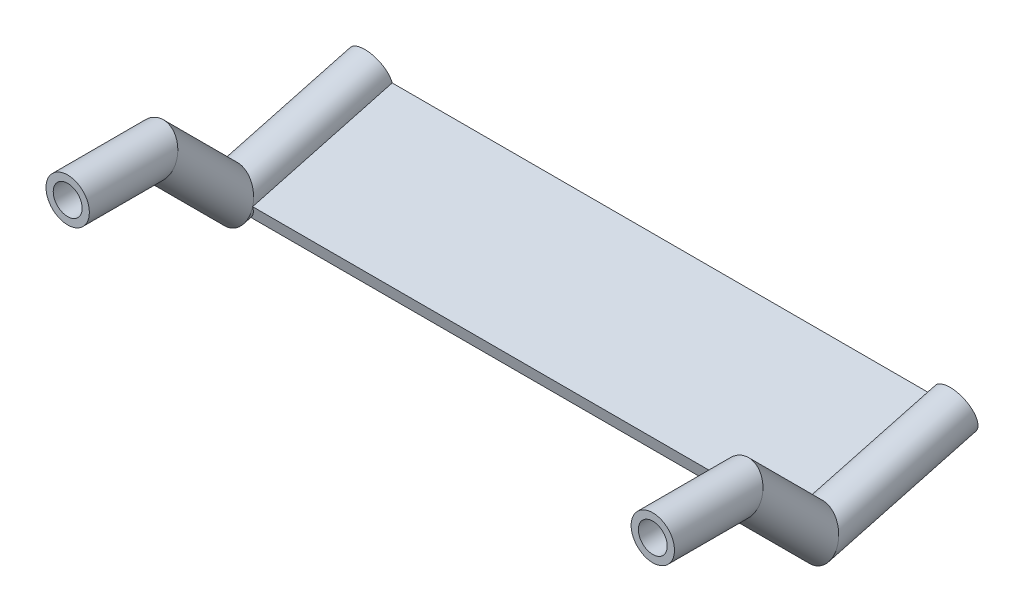
ISO-10303-21;
HEADER;
FILE_DESCRIPTION(('STEP AP214'),'2;1');
FILE_NAME('part.step','',(''),(''),'','','');
FILE_SCHEMA(('AUTOMOTIVE_DESIGN { 1 0 10303 214 1 1 1 1 }'));
ENDSEC;
DATA;
#1=APPLICATION_CONTEXT('core data for automotive mechanical design processes');
#2=APPLICATION_PROTOCOL_DEFINITION('international standard','automotive_design',2000,#1);
#3=PRODUCT_CONTEXT('',#1,'mechanical');
#4=PRODUCT('Part','Part','',(#3));
#5=PRODUCT_RELATED_PRODUCT_CATEGORY('part','',(#4));
#6=PRODUCT_DEFINITION_FORMATION('','',#4);
#7=PRODUCT_DEFINITION_CONTEXT('part definition',#1,'design');
#8=PRODUCT_DEFINITION('design','',#6,#7);
#9=PRODUCT_DEFINITION_SHAPE('','',#8);
#10=(LENGTH_UNIT() NAMED_UNIT(*) SI_UNIT(.MILLI.,.METRE.));
#11=(NAMED_UNIT(*) PLANE_ANGLE_UNIT() SI_UNIT($,.RADIAN.));
#12=(NAMED_UNIT(*) SI_UNIT($,.STERADIAN.) SOLID_ANGLE_UNIT());
#13=UNCERTAINTY_MEASURE_WITH_UNIT(LENGTH_MEASURE(1.E-05),#10,'distance_accuracy_value','');
#14=(GEOMETRIC_REPRESENTATION_CONTEXT(3) GLOBAL_UNCERTAINTY_ASSIGNED_CONTEXT((#13)) GLOBAL_UNIT_ASSIGNED_CONTEXT((#10,
#11,#12)) REPRESENTATION_CONTEXT('',''));
#15=CARTESIAN_POINT('',(0.,0.,0.));
#16=DIRECTION('',(0.,0.,1.));
#17=DIRECTION('',(1.,0.,0.));
#18=AXIS2_PLACEMENT_3D('',#15,#16,#17);
#19=CARTESIAN_POINT('',(0.,-111.023064179417,-207.566065913121));
#20=DIRECTION('',(0.,0.258819045102522,-0.965925826289068));
#21=DIRECTION('',(0.,0.965925826289068,0.258819045102522));
#22=AXIS2_PLACEMENT_3D('',#19,#20,#21);
#23=CYLINDRICAL_SURFACE('',#22,30.);
#24=DIRECTION('',(0.,0.258819045102522,-0.965925826289068));
#25=VECTOR('',#24,1.);
#26=CARTESIAN_POINT('',(22.3606797749979,-130.341580705198,-212.742446815172));
#27=LINE('',#26,#25);
#28=CARTESIAN_POINT('',(22.3606797749979,-125.384533703764,-231.242398080032));
#29=VERTEX_POINT('',#28);
#30=CARTESIAN_POINT('',(22.3606797749979,-73.6207246832593,-424.427563337846));
#31=VERTEX_POINT('',#30);
#32=EDGE_CURVE('E12',#29,#31,#27,.T.);
#33=ORIENTED_EDGE('',*,*,#32,.F.);
#34=CARTESIAN_POINT('',(0.,-106.066017177982,-226.066017177982));
#35=DIRECTION('',(0.,-0.258819045102522,0.965925826289068));
#36=DIRECTION('',(0.,-0.965925826289068,-0.258819045102522));
#37=AXIS2_PLACEMENT_3D('',#34,#35,#36);
#38=CIRCLE('',#37,30.);
#39=CARTESIAN_POINT('',(30.,-106.066017177982,-226.066017177982));
#40=VERTEX_POINT('',#39);
#41=EDGE_CURVE('E84',#29,#40,#38,.T.);
#42=ORIENTED_EDGE('',*,*,#41,.T.);
#43=CARTESIAN_POINT('',(0.,-106.066017177982,-226.066017177982));
#44=DIRECTION('',(0.,-0.258819045102521,-0.965925826289068));
#45=DIRECTION('',(0.,-0.965925826289068,0.258819045102521));
#46=AXIS2_PLACEMENT_3D('',#43,#44,#45);
#47=ELLIPSE('',#46,34.6410161513776,30.);
#48=EDGE_CURVE('E132',#40,#40,#47,.T.);
#49=ORIENTED_EDGE('',*,*,#48,.T.);
#50=DIRECTION('',(0.,0.258819045102522,-0.965925826289068));
#51=VECTOR('',#50,1.);
#52=CARTESIAN_POINT('',(30.,-111.023064179417,-207.566065913121));
#53=LINE('',#52,#51);
#54=CARTESIAN_POINT('',(30.,-54.3022081574779,-419.251182435796));
#55=VERTEX_POINT('',#54);
#56=EDGE_CURVE('E113',#40,#55,#53,.T.);
#57=ORIENTED_EDGE('',*,*,#56,.T.);
#58=CARTESIAN_POINT('',(0.,-54.3022081574779,-419.251182435796));
#59=DIRECTION('',(0.,-0.258819045102521,0.965925826289068));
#60=DIRECTION('',(0.,-0.965925826289068,-0.258819045102521));
#61=AXIS2_PLACEMENT_3D('',#58,#59,#60);
#62=CIRCLE('',#61,30.);
#63=EDGE_CURVE('E124',#55,#31,#62,.T.);
#64=ORIENTED_EDGE('',*,*,#63,.T.);
#65=EDGE_LOOP('',(#33,#42,#49,#57,#64));
#66=FACE_BOUND('',#65,.T.);
#67=ADVANCED_FACE('F39',(#66),#23,.T.);
#68=CARTESIAN_POINT('',(0.,-54.3022081574779,-419.251182435796));
#69=DIRECTION('',(0.,-0.258819045102521,0.965925826289068));
#70=DIRECTION('',(0.,-0.965925826289068,-0.258819045102521));
#71=AXIS2_PLACEMENT_3D('',#68,#69,#70);
#72=PLANE('',#71);
#73=DIRECTION('',(-1.,0.,0.));
#74=VECTOR('',#73,1.);
#75=CARTESIAN_POINT('',(780.,-73.6207246832593,-424.427563337846));
#76=LINE('',#75,#74);
#77=CARTESIAN_POINT('',(787.639320225002,-73.6207246832593,-424.427563337846));
#78=VERTEX_POINT('',#77);
#79=EDGE_CURVE('E62',#78,#31,#76,.T.);
#80=ORIENTED_EDGE('',*,*,#79,.T.);
#81=ORIENTED_EDGE('',*,*,#63,.F.);
#82=DIRECTION('',(-1.,0.,0.));
#83=VECTOR('',#82,1.);
#84=CARTESIAN_POINT('',(780.,-54.3022081574779,-419.251182435796));
#85=LINE('',#84,#83);
#86=CARTESIAN_POINT('',(780.,-54.3022081574779,-419.251182435796));
#87=VERTEX_POINT('',#86);
#88=EDGE_CURVE('E109',#87,#55,#85,.T.);
#89=ORIENTED_EDGE('',*,*,#88,.F.);
#90=CARTESIAN_POINT('',(810.,-54.3022081574779,-419.251182435796));
#91=DIRECTION('',(0.,0.258819045102521,-0.965925826289068));
#92=DIRECTION('',(0.,-0.965925826289068,-0.258819045102521));
#93=AXIS2_PLACEMENT_3D('',#90,#91,#92);
#94=CIRCLE('',#93,30.);
#95=EDGE_CURVE('E105',#87,#78,#94,.T.);
#96=ORIENTED_EDGE('',*,*,#95,.T.);
#97=EDGE_LOOP('',(#80,#81,#89,#96));
#98=FACE_BOUND('',#97,.T.);
#99=CARTESIAN_POINT('',(810.,-54.3022081574779,-419.251182435796));
#100=DIRECTION('',(0.,0.258819045102521,-0.965925826289068));
#101=DIRECTION('',(0.,-0.965925826289068,-0.258819045102521));
#102=AXIS2_PLACEMENT_3D('',#99,#100,#101);
#103=CIRCLE('',#102,20.);
#104=CARTESIAN_POINT('',(810.,-73.6207246832593,-424.427563337846));
#105=VERTEX_POINT('',#104);
#106=EDGE_CURVE('E143',#105,#105,#103,.T.);
#107=ORIENTED_EDGE('',*,*,#106,.F.);
#108=EDGE_LOOP('',(#107));
#109=FACE_BOUND('',#108,.T.);
#110=CARTESIAN_POINT('',(0.,-54.3022081574779,-419.251182435796));
#111=DIRECTION('',(0.,-0.258819045102521,0.965925826289068));
#112=DIRECTION('',(0.,-0.965925826289068,-0.258819045102521));
#113=AXIS2_PLACEMENT_3D('',#110,#111,#112);
#114=CIRCLE('',#113,20.);
#115=CARTESIAN_POINT('',(0.,-73.6207246832593,-424.427563337846));
#116=VERTEX_POINT('',#115);
#117=EDGE_CURVE('E116',#116,#116,#114,.T.);
#118=ORIENTED_EDGE('',*,*,#117,.T.);
#119=EDGE_LOOP('',(#118));
#120=FACE_BOUND('',#119,.T.);
#121=ADVANCED_FACE('F41',(#98,#109,#120),#72,.F.);
#122=CARTESIAN_POINT('',(0.,0.,0.));
#123=DIRECTION('',(0.,0.,1.));
#124=DIRECTION('',(0.,-1.,0.));
#125=AXIS2_PLACEMENT_3D('',#122,#123,#124);
#126=PLANE('',#125);
#127=CARTESIAN_POINT('',(0.,0.,0.));
#128=DIRECTION('',(0.,0.,1.));
#129=DIRECTION('',(0.,-1.,0.));
#130=AXIS2_PLACEMENT_3D('',#127,#128,#129);
#131=CIRCLE('',#130,20.);
#132=CARTESIAN_POINT('',(0.,-20.,0.));
#133=VERTEX_POINT('',#132);
#134=EDGE_CURVE('E120',#133,#133,#131,.T.);
#135=ORIENTED_EDGE('',*,*,#134,.F.);
#136=EDGE_LOOP('',(#135));
#137=FACE_BOUND('',#136,.T.);
#138=CARTESIAN_POINT('',(0.,0.,0.));
#139=DIRECTION('',(0.,0.,1.));
#140=DIRECTION('',(0.,-1.,0.));
#141=AXIS2_PLACEMENT_3D('',#138,#139,#140);
#142=CIRCLE('',#141,30.);
#143=CARTESIAN_POINT('',(0.,-30.,0.));
#144=VERTEX_POINT('',#143);
#145=EDGE_CURVE('E129',#144,#144,#142,.T.);
#146=ORIENTED_EDGE('',*,*,#145,.T.);
#147=EDGE_LOOP('',(#146));
#148=FACE_BOUND('',#147,.T.);
#149=ADVANCED_FACE('F182',(#137,#148),#126,.T.);
#150=CARTESIAN_POINT('',(0.,9.73618689896272,-110.263813101037));
#151=DIRECTION('',(0.,-0.707106781186548,-0.707106781186546));
#152=DIRECTION('',(0.,0.707106781186546,-0.707106781186549));
#153=AXIS2_PLACEMENT_3D('',#150,#151,#152);
#154=CYLINDRICAL_SURFACE('',#153,30.);
#155=CARTESIAN_POINT('',(0.,0.,-120.));
#156=DIRECTION('',(0.,-0.382683432365091,-0.923879532511287));
#157=DIRECTION('',(0.,0.923879532511287,-0.382683432365091));
#158=AXIS2_PLACEMENT_3D('',#155,#156,#157);
#159=ELLIPSE('',#158,32.4717660087718,30.);
#160=CARTESIAN_POINT('',(0.,30.,-132.426406871193));
#161=VERTEX_POINT('',#160);
#162=EDGE_CURVE('E47',#161,#161,#159,.T.);
#163=ORIENTED_EDGE('',*,*,#162,.T.);
#164=EDGE_LOOP('',(#163));
#165=FACE_BOUND('',#164,.T.);
#166=ORIENTED_EDGE('',*,*,#48,.F.);
#167=EDGE_LOOP('',(#166));
#168=FACE_BOUND('',#167,.T.);
#169=ADVANCED_FACE('F187',(#165,#168),#154,.T.);
#170=CARTESIAN_POINT('',(0.,0.,0.));
#171=DIRECTION('',(0.,0.,-1.));
#172=DIRECTION('',(-1.,0.,0.));
#173=AXIS2_PLACEMENT_3D('',#170,#171,#172);
#174=CYLINDRICAL_SURFACE('',#173,30.);
#175=ORIENTED_EDGE('',*,*,#145,.F.);
#176=EDGE_LOOP('',(#175));
#177=FACE_BOUND('',#176,.T.);
#178=ORIENTED_EDGE('',*,*,#162,.F.);
#179=EDGE_LOOP('',(#178));
#180=FACE_BOUND('',#179,.T.);
#181=ADVANCED_FACE('F178',(#177,#180),#174,.T.);
#182=CARTESIAN_POINT('',(0.,-111.023064179417,-207.566065913121));
#183=DIRECTION('',(0.,0.258819045102522,-0.965925826289068));
#184=DIRECTION('',(0.,0.965925826289068,0.258819045102522));
#185=AXIS2_PLACEMENT_3D('',#182,#183,#184);
#186=CYLINDRICAL_SURFACE('',#185,20.);
#187=ORIENTED_EDGE('',*,*,#117,.F.);
#188=EDGE_LOOP('',(#187));
#189=FACE_BOUND('',#188,.T.);
#190=CARTESIAN_POINT('',(0.,-106.066017177982,-226.066017177982));
#191=DIRECTION('',(0.,-0.258819045102521,-0.965925826289068));
#192=DIRECTION('',(0.,0.965925826289068,-0.258819045102521));
#193=AXIS2_PLACEMENT_3D('',#190,#191,#192);
#194=ELLIPSE('',#193,23.094010767585,20.);
#195=CARTESIAN_POINT('',(0.,-83.758915744974,-232.043186992436));
#196=VERTEX_POINT('',#195);
#197=EDGE_CURVE('E117',#196,#196,#194,.T.);
#198=ORIENTED_EDGE('',*,*,#197,.F.);
#199=EDGE_LOOP('',(#198));
#200=FACE_BOUND('',#199,.T.);
#201=ADVANCED_FACE('F186',(#189,#200),#186,.F.);
#202=CARTESIAN_POINT('',(0.,9.73618689896272,-110.263813101037));
#203=DIRECTION('',(0.,-0.707106781186548,-0.707106781186546));
#204=DIRECTION('',(0.,0.707106781186546,-0.707106781186549));
#205=AXIS2_PLACEMENT_3D('',#202,#203,#204);
#206=CYLINDRICAL_SURFACE('',#205,20.);
#207=CARTESIAN_POINT('',(0.,0.,-120.));
#208=DIRECTION('',(0.,-0.38268343236509,-0.923879532511287));
#209=DIRECTION('',(0.,-0.923879532511286,0.382683432365091));
#210=AXIS2_PLACEMENT_3D('',#207,#208,#209);
#211=ELLIPSE('',#210,21.6478440058479,20.);
#212=CARTESIAN_POINT('',(0.,-20.,-111.715728752538));
#213=VERTEX_POINT('',#212);
#214=EDGE_CURVE('E121',#213,#213,#211,.T.);
#215=ORIENTED_EDGE('',*,*,#214,.F.);
#216=EDGE_LOOP('',(#215));
#217=FACE_BOUND('',#216,.T.);
#218=ORIENTED_EDGE('',*,*,#197,.T.);
#219=EDGE_LOOP('',(#218));
#220=FACE_BOUND('',#219,.T.);
#221=ADVANCED_FACE('F194',(#217,#220),#206,.F.);
#222=CARTESIAN_POINT('',(0.,0.,0.));
#223=DIRECTION('',(0.,0.,-1.));
#224=DIRECTION('',(-1.,0.,0.));
#225=AXIS2_PLACEMENT_3D('',#222,#223,#224);
#226=CYLINDRICAL_SURFACE('',#225,20.);
#227=ORIENTED_EDGE('',*,*,#134,.T.);
#228=EDGE_LOOP('',(#227));
#229=FACE_BOUND('',#228,.T.);
#230=ORIENTED_EDGE('',*,*,#214,.T.);
#231=EDGE_LOOP('',(#230));
#232=FACE_BOUND('',#231,.T.);
#233=ADVANCED_FACE('F183',(#229,#232),#226,.F.);
#234=CARTESIAN_POINT('',(780.,-125.384533703764,-231.242398080032));
#235=DIRECTION('',(0.,0.965925826289068,0.258819045102522));
#236=DIRECTION('',(0.,-0.258819045102522,0.965925826289068));
#237=AXIS2_PLACEMENT_3D('',#234,#235,#236);
#238=PLANE('',#237);
#239=DIRECTION('',(-1.,0.,0.));
#240=VECTOR('',#239,1.);
#241=CARTESIAN_POINT('',(780.,-125.384533703764,-231.242398080032));
#242=LINE('',#241,#240);
#243=CARTESIAN_POINT('',(787.639320225002,-125.384533703764,-231.242398080032));
#244=VERTEX_POINT('',#243);
#245=EDGE_CURVE('E79',#244,#29,#242,.T.);
#246=ORIENTED_EDGE('',*,*,#245,.T.);
#247=ORIENTED_EDGE('',*,*,#32,.T.);
#248=ORIENTED_EDGE('',*,*,#79,.F.);
#249=DIRECTION('',(0.,0.258819045102522,-0.965925826289068));
#250=VECTOR('',#249,1.);
#251=CARTESIAN_POINT('',(787.639320225002,-130.341580705198,-212.742446815172));
#252=LINE('',#251,#250);
#253=EDGE_CURVE('E88',#244,#78,#252,.T.);
#254=ORIENTED_EDGE('',*,*,#253,.F.);
#255=EDGE_LOOP('',(#246,#247,#248,#254));
#256=FACE_BOUND('',#255,.T.);
#257=ADVANCED_FACE('F98',(#256),#238,.F.);
#258=CARTESIAN_POINT('',(780.,-106.066017177982,-226.066017177982));
#259=DIRECTION('',(0.,0.965925826289068,0.258819045102522));
#260=DIRECTION('',(0.,-0.258819045102522,0.965925826289068));
#261=AXIS2_PLACEMENT_3D('',#258,#259,#260);
#262=PLANE('',#261);
#263=ORIENTED_EDGE('',*,*,#56,.F.);
#264=DIRECTION('',(-1.,0.,0.));
#265=VECTOR('',#264,1.);
#266=CARTESIAN_POINT('',(780.,-106.066017177982,-226.066017177982));
#267=LINE('',#266,#265);
#268=CARTESIAN_POINT('',(780.,-106.066017177982,-226.066017177982));
#269=VERTEX_POINT('',#268);
#270=EDGE_CURVE('E54',#269,#40,#267,.T.);
#271=ORIENTED_EDGE('',*,*,#270,.F.);
#272=DIRECTION('',(0.,0.258819045102522,-0.965925826289068));
#273=VECTOR('',#272,1.);
#274=CARTESIAN_POINT('',(780.,-111.023064179417,-207.566065913121));
#275=LINE('',#274,#273);
#276=EDGE_CURVE('E96',#269,#87,#275,.T.);
#277=ORIENTED_EDGE('',*,*,#276,.T.);
#278=ORIENTED_EDGE('',*,*,#88,.T.);
#279=EDGE_LOOP('',(#263,#271,#277,#278));
#280=FACE_BOUND('',#279,.T.);
#281=ADVANCED_FACE('F142',(#280),#262,.T.);
#282=CARTESIAN_POINT('',(780.,-125.384533703764,-231.242398080032));
#283=DIRECTION('',(0.,-0.258819045102522,0.965925826289068));
#284=DIRECTION('',(0.,-0.965925826289068,-0.258819045102522));
#285=AXIS2_PLACEMENT_3D('',#282,#283,#284);
#286=PLANE('',#285);
#287=ORIENTED_EDGE('',*,*,#270,.T.);
#288=ORIENTED_EDGE('',*,*,#41,.F.);
#289=ORIENTED_EDGE('',*,*,#245,.F.);
#290=CARTESIAN_POINT('',(810.,-106.066017177982,-226.066017177982));
#291=DIRECTION('',(0.,0.258819045102522,-0.965925826289068));
#292=DIRECTION('',(0.,-0.965925826289068,-0.258819045102522));
#293=AXIS2_PLACEMENT_3D('',#290,#291,#292);
#294=CIRCLE('',#293,30.);
#295=EDGE_CURVE('E82',#244,#269,#294,.T.);
#296=ORIENTED_EDGE('',*,*,#295,.T.);
#297=EDGE_LOOP('',(#287,#288,#289,#296));
#298=FACE_BOUND('',#297,.T.);
#299=ADVANCED_FACE('F81',(#298),#286,.T.);
#300=CARTESIAN_POINT('',(810.,-111.023064179417,-207.566065913121));
#301=DIRECTION('',(0.,0.258819045102522,-0.965925826289068));
#302=DIRECTION('',(0.,0.965925826289068,0.258819045102522));
#303=AXIS2_PLACEMENT_3D('',#300,#301,#302);
#304=CYLINDRICAL_SURFACE('',#303,30.);
#305=ORIENTED_EDGE('',*,*,#253,.T.);
#306=ORIENTED_EDGE('',*,*,#95,.F.);
#307=ORIENTED_EDGE('',*,*,#276,.F.);
#308=CARTESIAN_POINT('',(810.,-106.066017177982,-226.066017177982));
#309=DIRECTION('',(0.,0.258819045102521,0.965925826289068));
#310=DIRECTION('',(0.,-0.965925826289068,0.258819045102521));
#311=AXIS2_PLACEMENT_3D('',#308,#309,#310);
#312=ELLIPSE('',#311,34.6410161513776,30.);
#313=EDGE_CURVE('E95',#269,#269,#312,.T.);
#314=ORIENTED_EDGE('',*,*,#313,.F.);
#315=ORIENTED_EDGE('',*,*,#295,.F.);
#316=EDGE_LOOP('',(#305,#306,#307,#314,#315));
#317=FACE_BOUND('',#316,.T.);
#318=ADVANCED_FACE('F93',(#317),#304,.T.);
#319=CARTESIAN_POINT('',(810.,0.,0.));
#320=DIRECTION('',(0.,0.,1.));
#321=DIRECTION('',(0.,-1.,0.));
#322=AXIS2_PLACEMENT_3D('',#319,#320,#321);
#323=PLANE('',#322);
#324=CARTESIAN_POINT('',(810.,0.,0.));
#325=DIRECTION('',(0.,0.,-1.));
#326=DIRECTION('',(0.,-1.,0.));
#327=AXIS2_PLACEMENT_3D('',#324,#325,#326);
#328=CIRCLE('',#327,20.);
#329=CARTESIAN_POINT('',(810.,-20.,0.));
#330=VERTEX_POINT('',#329);
#331=EDGE_CURVE('E151',#330,#330,#328,.T.);
#332=ORIENTED_EDGE('',*,*,#331,.T.);
#333=EDGE_LOOP('',(#332));
#334=FACE_BOUND('',#333,.T.);
#335=CARTESIAN_POINT('',(810.,0.,0.));
#336=DIRECTION('',(0.,0.,-1.));
#337=DIRECTION('',(0.,-1.,0.));
#338=AXIS2_PLACEMENT_3D('',#335,#336,#337);
#339=CIRCLE('',#338,30.);
#340=CARTESIAN_POINT('',(810.,-30.,0.));
#341=VERTEX_POINT('',#340);
#342=EDGE_CURVE('E102',#341,#341,#339,.T.);
#343=ORIENTED_EDGE('',*,*,#342,.F.);
#344=EDGE_LOOP('',(#343));
#345=FACE_BOUND('',#344,.T.);
#346=ADVANCED_FACE('F162',(#334,#345),#323,.T.);
#347=CARTESIAN_POINT('',(810.,9.73618689896272,-110.263813101037));
#348=DIRECTION('',(0.,-0.707106781186548,-0.707106781186546));
#349=DIRECTION('',(0.,0.707106781186546,-0.707106781186549));
#350=AXIS2_PLACEMENT_3D('',#347,#348,#349);
#351=CYLINDRICAL_SURFACE('',#350,30.);
#352=CARTESIAN_POINT('',(810.,0.,-120.));
#353=DIRECTION('',(0.,0.382683432365091,0.923879532511287));
#354=DIRECTION('',(0.,0.923879532511287,-0.382683432365091));
#355=AXIS2_PLACEMENT_3D('',#352,#353,#354);
#356=ELLIPSE('',#355,32.4717660087718,30.);
#357=CARTESIAN_POINT('',(810.,30.,-132.426406871193));
#358=VERTEX_POINT('',#357);
#359=EDGE_CURVE('E99',#358,#358,#356,.T.);
#360=ORIENTED_EDGE('',*,*,#359,.F.);
#361=EDGE_LOOP('',(#360));
#362=FACE_BOUND('',#361,.T.);
#363=ORIENTED_EDGE('',*,*,#313,.T.);
#364=EDGE_LOOP('',(#363));
#365=FACE_BOUND('',#364,.T.);
#366=ADVANCED_FACE('F159',(#362,#365),#351,.T.);
#367=CARTESIAN_POINT('',(810.,0.,0.));
#368=DIRECTION('',(0.,0.,-1.));
#369=DIRECTION('',(1.,0.,0.));
#370=AXIS2_PLACEMENT_3D('',#367,#368,#369);
#371=CYLINDRICAL_SURFACE('',#370,30.);
#372=ORIENTED_EDGE('',*,*,#342,.T.);
#373=EDGE_LOOP('',(#372));
#374=FACE_BOUND('',#373,.T.);
#375=ORIENTED_EDGE('',*,*,#359,.T.);
#376=EDGE_LOOP('',(#375));
#377=FACE_BOUND('',#376,.T.);
#378=ADVANCED_FACE('F161',(#374,#377),#371,.T.);
#379=CARTESIAN_POINT('',(810.,-111.023064179417,-207.566065913121));
#380=DIRECTION('',(0.,0.258819045102522,-0.965925826289068));
#381=DIRECTION('',(0.,0.965925826289068,0.258819045102522));
#382=AXIS2_PLACEMENT_3D('',#379,#380,#381);
#383=CYLINDRICAL_SURFACE('',#382,20.);
#384=ORIENTED_EDGE('',*,*,#106,.T.);
#385=EDGE_LOOP('',(#384));
#386=FACE_BOUND('',#385,.T.);
#387=CARTESIAN_POINT('',(810.,-106.066017177982,-226.066017177982));
#388=DIRECTION('',(0.,0.258819045102521,0.965925826289068));
#389=DIRECTION('',(0.,0.965925826289068,-0.258819045102521));
#390=AXIS2_PLACEMENT_3D('',#387,#388,#389);
#391=ELLIPSE('',#390,23.094010767585,20.);
#392=CARTESIAN_POINT('',(810.,-83.758915744974,-232.043186992436));
#393=VERTEX_POINT('',#392);
#394=EDGE_CURVE('E146',#393,#393,#391,.T.);
#395=ORIENTED_EDGE('',*,*,#394,.T.);
#396=EDGE_LOOP('',(#395));
#397=FACE_BOUND('',#396,.T.);
#398=ADVANCED_FACE('F169',(#386,#397),#383,.F.);
#399=CARTESIAN_POINT('',(810.,9.73618689896272,-110.263813101037));
#400=DIRECTION('',(0.,-0.707106781186548,-0.707106781186546));
#401=DIRECTION('',(0.,0.707106781186546,-0.707106781186549));
#402=AXIS2_PLACEMENT_3D('',#399,#400,#401);
#403=CYLINDRICAL_SURFACE('',#402,20.);
#404=CARTESIAN_POINT('',(810.,0.,-120.));
#405=DIRECTION('',(0.,0.38268343236509,0.923879532511287));
#406=DIRECTION('',(0.,-0.923879532511286,0.382683432365091));
#407=AXIS2_PLACEMENT_3D('',#404,#405,#406);
#408=ELLIPSE('',#407,21.6478440058479,20.);
#409=CARTESIAN_POINT('',(810.,-20.,-111.715728752538));
#410=VERTEX_POINT('',#409);
#411=EDGE_CURVE('E152',#410,#410,#408,.T.);
#412=ORIENTED_EDGE('',*,*,#411,.T.);
#413=EDGE_LOOP('',(#412));
#414=FACE_BOUND('',#413,.T.);
#415=ORIENTED_EDGE('',*,*,#394,.F.);
#416=EDGE_LOOP('',(#415));
#417=FACE_BOUND('',#416,.T.);
#418=ADVANCED_FACE('F240',(#414,#417),#403,.F.);
#419=CARTESIAN_POINT('',(810.,0.,0.));
#420=DIRECTION('',(0.,0.,-1.));
#421=DIRECTION('',(1.,0.,0.));
#422=AXIS2_PLACEMENT_3D('',#419,#420,#421);
#423=CYLINDRICAL_SURFACE('',#422,20.);
#424=ORIENTED_EDGE('',*,*,#331,.F.);
#425=EDGE_LOOP('',(#424));
#426=FACE_BOUND('',#425,.T.);
#427=ORIENTED_EDGE('',*,*,#411,.F.);
#428=EDGE_LOOP('',(#427));
#429=FACE_BOUND('',#428,.T.);
#430=ADVANCED_FACE('F250',(#426,#429),#423,.F.);
#431=CLOSED_SHELL('',(#67,#121,#149,#169,#181,#201,#221,#233,#257,#281,#299,#318,#346,#366,#378,
#398,#418,#430));
#432=MANIFOLD_SOLID_BREP('B2',#431);
#433=ADVANCED_BREP_SHAPE_REPRESENTATION('',(#18,#432),#14);
#434=SHAPE_DEFINITION_REPRESENTATION(#9,#433);
ENDSEC;
END-ISO-10303-21;
